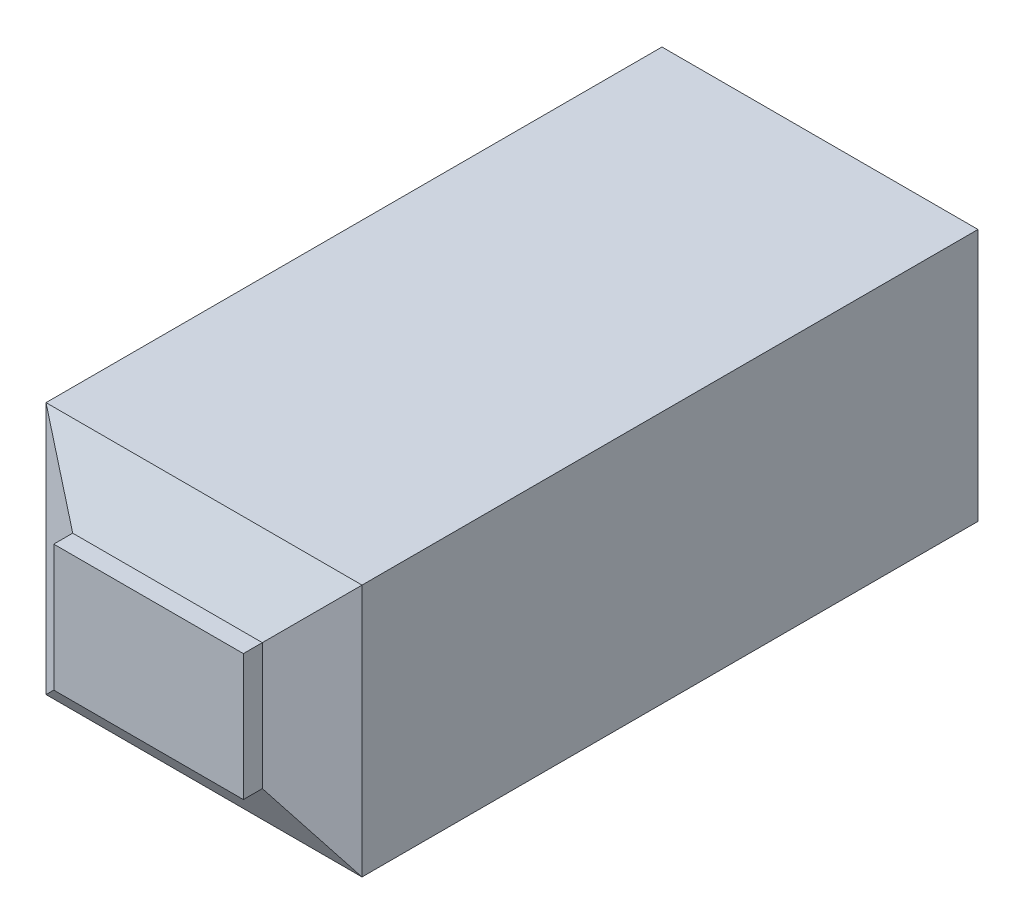
ISO-10303-21;
HEADER;
FILE_DESCRIPTION(('STEP AP214'),'2;1');
FILE_NAME('part.step','',(''),(''),'','','');
FILE_SCHEMA(('AUTOMOTIVE_DESIGN { 1 0 10303 214 1 1 1 1 }'));
ENDSEC;
DATA;
#1=APPLICATION_CONTEXT('core data for automotive mechanical design processes');
#2=APPLICATION_PROTOCOL_DEFINITION('international standard','automotive_design',2000,#1);
#3=PRODUCT_CONTEXT('',#1,'mechanical');
#4=PRODUCT('Part','Part','',(#3));
#5=PRODUCT_RELATED_PRODUCT_CATEGORY('part','',(#4));
#6=PRODUCT_DEFINITION_FORMATION('','',#4);
#7=PRODUCT_DEFINITION_CONTEXT('part definition',#1,'design');
#8=PRODUCT_DEFINITION('design','',#6,#7);
#9=PRODUCT_DEFINITION_SHAPE('','',#8);
#10=(LENGTH_UNIT() NAMED_UNIT(*) SI_UNIT(.MILLI.,.METRE.));
#11=(NAMED_UNIT(*) PLANE_ANGLE_UNIT() SI_UNIT($,.RADIAN.));
#12=(NAMED_UNIT(*) SI_UNIT($,.STERADIAN.) SOLID_ANGLE_UNIT());
#13=UNCERTAINTY_MEASURE_WITH_UNIT(LENGTH_MEASURE(1.E-05),#10,'distance_accuracy_value','');
#14=(GEOMETRIC_REPRESENTATION_CONTEXT(3) GLOBAL_UNCERTAINTY_ASSIGNED_CONTEXT((#13)) GLOBAL_UNIT_ASSIGNED_CONTEXT((#10,
#11,#12)) REPRESENTATION_CONTEXT('',''));
#15=CARTESIAN_POINT('',(0.,0.,0.));
#16=DIRECTION('',(0.,0.,1.));
#17=DIRECTION('',(1.,0.,0.));
#18=AXIS2_PLACEMENT_3D('',#15,#16,#17);
#19=CARTESIAN_POINT('',(25.,-20.,-115.));
#20=DIRECTION('',(1.,0.,0.));
#21=DIRECTION('',(0.,0.,-1.));
#22=AXIS2_PLACEMENT_3D('',#19,#20,#21);
#23=PLANE('',#22);
#24=DIRECTION('',(0.,0.,1.));
#25=VECTOR('',#24,1.);
#26=CARTESIAN_POINT('',(25.,-20.,-115.));
#27=LINE('',#26,#25);
#28=CARTESIAN_POINT('',(25.,-20.,-106.226497308104));
#29=VERTEX_POINT('',#28);
#30=CARTESIAN_POINT('',(25.,-20.,-8.77350269189622));
#31=VERTEX_POINT('',#30);
#32=EDGE_CURVE('E11',#29,#31,#27,.T.);
#33=ORIENTED_EDGE('',*,*,#32,.F.);
#34=DIRECTION('',(0.,1.,0.));
#35=VECTOR('',#34,1.);
#36=CARTESIAN_POINT('',(25.,-21.1,-106.226497308104));
#37=LINE('',#36,#35);
#38=CARTESIAN_POINT('',(25.,20.,-106.226497308104));
#39=VERTEX_POINT('',#38);
#40=EDGE_CURVE('E133',#29,#39,#37,.T.);
#41=ORIENTED_EDGE('',*,*,#40,.T.);
#42=DIRECTION('',(0.,0.,1.));
#43=VECTOR('',#42,1.);
#44=CARTESIAN_POINT('',(25.,20.,-115.));
#45=LINE('',#44,#43);
#46=CARTESIAN_POINT('',(25.,20.,-8.77350269189622));
#47=VERTEX_POINT('',#46);
#48=EDGE_CURVE('E40',#39,#47,#45,.T.);
#49=ORIENTED_EDGE('',*,*,#48,.T.);
#50=DIRECTION('',(0.,1.,0.));
#51=VECTOR('',#50,1.);
#52=CARTESIAN_POINT('',(25.,-21.1,-8.77350269189622));
#53=LINE('',#52,#51);
#54=EDGE_CURVE('E193',#31,#47,#53,.T.);
#55=ORIENTED_EDGE('',*,*,#54,.F.);
#56=EDGE_LOOP('',(#33,#41,#49,#55));
#57=FACE_BOUND('',#56,.T.);
#58=ADVANCED_FACE('F37',(#57),#23,.T.);
#59=CARTESIAN_POINT('',(-25.,-20.,-115.));
#60=DIRECTION('',(0.,-1.,0.));
#61=DIRECTION('',(0.,0.,-1.));
#62=AXIS2_PLACEMENT_3D('',#59,#60,#61);
#63=PLANE('',#62);
#64=DIRECTION('',(0.,0.,1.));
#65=VECTOR('',#64,1.);
#66=CARTESIAN_POINT('',(-25.,-20.,-115.));
#67=LINE('',#66,#65);
#68=CARTESIAN_POINT('',(-25.,-20.,-106.226497308104));
#69=VERTEX_POINT('',#68);
#70=CARTESIAN_POINT('',(-25.,-20.,-8.77350269189622));
#71=VERTEX_POINT('',#70);
#72=EDGE_CURVE('E45',#69,#71,#67,.T.);
#73=ORIENTED_EDGE('',*,*,#72,.F.);
#74=DIRECTION('',(1.,0.,0.));
#75=VECTOR('',#74,1.);
#76=CARTESIAN_POINT('',(-26.1,-20.,-106.226497308104));
#77=LINE('',#76,#75);
#78=EDGE_CURVE('E226',#69,#29,#77,.T.);
#79=ORIENTED_EDGE('',*,*,#78,.T.);
#80=ORIENTED_EDGE('',*,*,#32,.T.);
#81=DIRECTION('',(1.,0.,0.));
#82=VECTOR('',#81,1.);
#83=CARTESIAN_POINT('',(-26.1,-20.,-8.77350269189622));
#84=LINE('',#83,#82);
#85=EDGE_CURVE('E201',#71,#31,#84,.T.);
#86=ORIENTED_EDGE('',*,*,#85,.F.);
#87=EDGE_LOOP('',(#73,#79,#80,#86));
#88=FACE_BOUND('',#87,.T.);
#89=ADVANCED_FACE('F225',(#88),#63,.T.);
#90=CARTESIAN_POINT('',(-25.,-20.,-115.));
#91=DIRECTION('',(-1.,0.,0.));
#92=DIRECTION('',(0.,0.,1.));
#93=AXIS2_PLACEMENT_3D('',#90,#91,#92);
#94=PLANE('',#93);
#95=DIRECTION('',(0.,0.,1.));
#96=VECTOR('',#95,1.);
#97=CARTESIAN_POINT('',(-25.,20.,-115.));
#98=LINE('',#97,#96);
#99=CARTESIAN_POINT('',(-25.,20.,-106.226497308104));
#100=VERTEX_POINT('',#99);
#101=CARTESIAN_POINT('',(-25.,20.,-8.77350269189622));
#102=VERTEX_POINT('',#101);
#103=EDGE_CURVE('E157',#100,#102,#98,.T.);
#104=ORIENTED_EDGE('',*,*,#103,.F.);
#105=DIRECTION('',(0.,-1.,0.));
#106=VECTOR('',#105,1.);
#107=CARTESIAN_POINT('',(-25.,21.1,-106.226497308104));
#108=LINE('',#107,#106);
#109=EDGE_CURVE('E212',#100,#69,#108,.T.);
#110=ORIENTED_EDGE('',*,*,#109,.T.);
#111=ORIENTED_EDGE('',*,*,#72,.T.);
#112=DIRECTION('',(0.,-1.,0.));
#113=VECTOR('',#112,1.);
#114=CARTESIAN_POINT('',(-25.,21.1,-8.77350269189622));
#115=LINE('',#114,#113);
#116=EDGE_CURVE('E176',#102,#71,#115,.T.);
#117=ORIENTED_EDGE('',*,*,#116,.F.);
#118=EDGE_LOOP('',(#104,#110,#111,#117));
#119=FACE_BOUND('',#118,.T.);
#120=ADVANCED_FACE('F211',(#119),#94,.T.);
#121=CARTESIAN_POINT('',(-25.,20.,-115.));
#122=DIRECTION('',(0.,1.,0.));
#123=DIRECTION('',(0.,0.,1.));
#124=AXIS2_PLACEMENT_3D('',#121,#122,#123);
#125=PLANE('',#124);
#126=ORIENTED_EDGE('',*,*,#48,.F.);
#127=DIRECTION('',(-1.,0.,0.));
#128=VECTOR('',#127,1.);
#129=CARTESIAN_POINT('',(26.1,20.,-106.226497308104));
#130=LINE('',#129,#128);
#131=EDGE_CURVE('E139',#39,#100,#130,.T.);
#132=ORIENTED_EDGE('',*,*,#131,.T.);
#133=ORIENTED_EDGE('',*,*,#103,.T.);
#134=DIRECTION('',(-1.,0.,0.));
#135=VECTOR('',#134,1.);
#136=CARTESIAN_POINT('',(26.1,20.,-8.77350269189622));
#137=LINE('',#136,#135);
#138=EDGE_CURVE('E156',#47,#102,#137,.T.);
#139=ORIENTED_EDGE('',*,*,#138,.F.);
#140=EDGE_LOOP('',(#126,#132,#133,#139));
#141=FACE_BOUND('',#140,.T.);
#142=ADVANCED_FACE('F154',(#141),#125,.T.);
#143=CARTESIAN_POINT('',(-26.1,-9.99999999999998,0.));
#144=DIRECTION('',(0.,-1.,0.));
#145=DIRECTION('',(0.,0.,-1.));
#146=AXIS2_PLACEMENT_3D('',#143,#144,#145);
#147=PLANE('',#146);
#148=DIRECTION('',(1.,0.,0.));
#149=VECTOR('',#148,1.);
#150=CARTESIAN_POINT('',(-26.1,-9.99999999999998,-3.));
#151=LINE('',#150,#149);
#152=CARTESIAN_POINT('',(-15.,-9.99999999999998,-3.));
#153=VERTEX_POINT('',#152);
#154=CARTESIAN_POINT('',(15.,-9.99999999999998,-3.));
#155=VERTEX_POINT('',#154);
#156=EDGE_CURVE('E190',#153,#155,#151,.T.);
#157=ORIENTED_EDGE('',*,*,#156,.T.);
#158=DIRECTION('',(0.,0.,1.));
#159=VECTOR('',#158,1.);
#160=CARTESIAN_POINT('',(15.,-9.99999999999998,0.));
#161=LINE('',#160,#159);
#162=CARTESIAN_POINT('',(15.,-9.99999999999998,0.));
#163=VERTEX_POINT('',#162);
#164=EDGE_CURVE('E185',#155,#163,#161,.T.);
#165=ORIENTED_EDGE('',*,*,#164,.T.);
#166=DIRECTION('',(1.,0.,0.));
#167=VECTOR('',#166,1.);
#168=CARTESIAN_POINT('',(-26.1,-9.99999999999998,0.));
#169=LINE('',#168,#167);
#170=CARTESIAN_POINT('',(-15.,-9.99999999999998,0.));
#171=VERTEX_POINT('',#170);
#172=EDGE_CURVE('E198',#171,#163,#169,.T.);
#173=ORIENTED_EDGE('',*,*,#172,.F.);
#174=DIRECTION('',(0.,0.,1.));
#175=VECTOR('',#174,1.);
#176=CARTESIAN_POINT('',(-15.,-9.99999999999998,0.));
#177=LINE('',#176,#175);
#178=EDGE_CURVE('E168',#153,#171,#177,.T.);
#179=ORIENTED_EDGE('',*,*,#178,.F.);
#180=EDGE_LOOP('',(#157,#165,#173,#179));
#181=FACE_BOUND('',#180,.T.);
#182=ADVANCED_FACE('F253',(#181),#147,.T.);
#183=CARTESIAN_POINT('',(-26.1,-9.99999999999998,-3.));
#184=DIRECTION('',(0.,-0.499999999999998,0.86602540378444));
#185=DIRECTION('',(0.,-0.86602540378444,-0.499999999999998));
#186=AXIS2_PLACEMENT_3D('',#183,#184,#185);
#187=PLANE('',#186);
#188=ORIENTED_EDGE('',*,*,#85,.T.);
#189=DIRECTION('',(-0.654653670707978,0.654653670707978,0.377964473009225));
#190=VECTOR('',#189,1.);
#191=CARTESIAN_POINT('',(19.7571428571428,-14.7571428571429,-5.74653770914492));
#192=LINE('',#191,#190);
#193=EDGE_CURVE('E188',#31,#155,#192,.T.);
#194=ORIENTED_EDGE('',*,*,#193,.T.);
#195=ORIENTED_EDGE('',*,*,#156,.F.);
#196=DIRECTION('',(0.654653670707978,0.654653670707978,0.377964473009225));
#197=VECTOR('',#196,1.);
#198=CARTESIAN_POINT('',(-1.67142857142853,3.32857142857146,4.69525430219883));
#199=LINE('',#198,#197);
#200=EDGE_CURVE('E172',#71,#153,#199,.T.);
#201=ORIENTED_EDGE('',*,*,#200,.F.);
#202=EDGE_LOOP('',(#188,#194,#195,#201));
#203=FACE_BOUND('',#202,.T.);
#204=ADVANCED_FACE('F217',(#203),#187,.T.);
#205=CARTESIAN_POINT('',(15.,-21.1,0.));
#206=DIRECTION('',(1.,0.,0.));
#207=DIRECTION('',(0.,0.,-1.));
#208=AXIS2_PLACEMENT_3D('',#205,#206,#207);
#209=PLANE('',#208);
#210=DIRECTION('',(0.,1.,0.));
#211=VECTOR('',#210,1.);
#212=CARTESIAN_POINT('',(15.,-21.1,-3.));
#213=LINE('',#212,#211);
#214=CARTESIAN_POINT('',(15.,9.99999999999998,-3.));
#215=VERTEX_POINT('',#214);
#216=EDGE_CURVE('E177',#155,#215,#213,.T.);
#217=ORIENTED_EDGE('',*,*,#216,.T.);
#218=DIRECTION('',(0.,0.,1.));
#219=VECTOR('',#218,1.);
#220=CARTESIAN_POINT('',(15.,9.99999999999998,0.));
#221=LINE('',#220,#219);
#222=CARTESIAN_POINT('',(15.,9.99999999999998,0.));
#223=VERTEX_POINT('',#222);
#224=EDGE_CURVE('E171',#215,#223,#221,.T.);
#225=ORIENTED_EDGE('',*,*,#224,.T.);
#226=DIRECTION('',(0.,1.,0.));
#227=VECTOR('',#226,1.);
#228=CARTESIAN_POINT('',(15.,-21.1,0.));
#229=LINE('',#228,#227);
#230=EDGE_CURVE('E187',#163,#223,#229,.T.);
#231=ORIENTED_EDGE('',*,*,#230,.F.);
#232=ORIENTED_EDGE('',*,*,#164,.F.);
#233=EDGE_LOOP('',(#217,#225,#231,#232));
#234=FACE_BOUND('',#233,.T.);
#235=ADVANCED_FACE('F257',(#234),#209,.T.);
#236=CARTESIAN_POINT('',(15.,-21.1,-3.));
#237=DIRECTION('',(0.499999999999998,0.,0.86602540378444));
#238=DIRECTION('',(0.86602540378444,0.,-0.499999999999998));
#239=AXIS2_PLACEMENT_3D('',#236,#237,#238);
#240=PLANE('',#239);
#241=ORIENTED_EDGE('',*,*,#54,.T.);
#242=DIRECTION('',(-0.654653670707978,-0.654653670707978,0.377964473009225));
#243=VECTOR('',#242,1.);
#244=CARTESIAN_POINT('',(19.7571428571429,14.7571428571429,-5.74653770914493));
#245=LINE('',#244,#243);
#246=EDGE_CURVE('E241',#47,#215,#245,.T.);
#247=ORIENTED_EDGE('',*,*,#246,.T.);
#248=ORIENTED_EDGE('',*,*,#216,.F.);
#249=ORIENTED_EDGE('',*,*,#193,.F.);
#250=EDGE_LOOP('',(#241,#247,#248,#249));
#251=FACE_BOUND('',#250,.T.);
#252=ADVANCED_FACE('F259',(#251),#240,.T.);
#253=CARTESIAN_POINT('',(-15.,21.1,0.));
#254=DIRECTION('',(-1.,0.,0.));
#255=DIRECTION('',(0.,0.,1.));
#256=AXIS2_PLACEMENT_3D('',#253,#254,#255);
#257=PLANE('',#256);
#258=DIRECTION('',(0.,-1.,0.));
#259=VECTOR('',#258,1.);
#260=CARTESIAN_POINT('',(-15.,21.1,-3.));
#261=LINE('',#260,#259);
#262=CARTESIAN_POINT('',(-15.,9.99999999999998,-3.));
#263=VERTEX_POINT('',#262);
#264=EDGE_CURVE('E180',#263,#153,#261,.T.);
#265=ORIENTED_EDGE('',*,*,#264,.T.);
#266=ORIENTED_EDGE('',*,*,#178,.T.);
#267=DIRECTION('',(0.,-1.,0.));
#268=VECTOR('',#267,1.);
#269=CARTESIAN_POINT('',(-15.,21.1,0.));
#270=LINE('',#269,#268);
#271=CARTESIAN_POINT('',(-15.,9.99999999999998,0.));
#272=VERTEX_POINT('',#271);
#273=EDGE_CURVE('E173',#272,#171,#270,.T.);
#274=ORIENTED_EDGE('',*,*,#273,.F.);
#275=DIRECTION('',(0.,0.,1.));
#276=VECTOR('',#275,1.);
#277=CARTESIAN_POINT('',(-15.,9.99999999999998,0.));
#278=LINE('',#277,#276);
#279=EDGE_CURVE('E239',#263,#272,#278,.T.);
#280=ORIENTED_EDGE('',*,*,#279,.F.);
#281=EDGE_LOOP('',(#265,#266,#274,#280));
#282=FACE_BOUND('',#281,.T.);
#283=ADVANCED_FACE('F251',(#282),#257,.T.);
#284=CARTESIAN_POINT('',(-15.,21.1,-3.));
#285=DIRECTION('',(-0.499999999999998,0.,0.86602540378444));
#286=DIRECTION('',(0.86602540378444,0.,0.499999999999998));
#287=AXIS2_PLACEMENT_3D('',#284,#285,#286);
#288=PLANE('',#287);
#289=ORIENTED_EDGE('',*,*,#116,.T.);
#290=ORIENTED_EDGE('',*,*,#200,.T.);
#291=ORIENTED_EDGE('',*,*,#264,.F.);
#292=DIRECTION('',(0.654653670707978,-0.654653670707978,0.377964473009225));
#293=VECTOR('',#292,1.);
#294=CARTESIAN_POINT('',(2.61428571428576,-7.61428571428576,7.16961259872578));
#295=LINE('',#294,#293);
#296=EDGE_CURVE('E224',#102,#263,#295,.T.);
#297=ORIENTED_EDGE('',*,*,#296,.F.);
#298=EDGE_LOOP('',(#289,#290,#291,#297));
#299=FACE_BOUND('',#298,.T.);
#300=ADVANCED_FACE('F222',(#299),#288,.T.);
#301=CARTESIAN_POINT('',(26.1,9.99999999999998,0.));
#302=DIRECTION('',(0.,1.,0.));
#303=DIRECTION('',(0.,0.,1.));
#304=AXIS2_PLACEMENT_3D('',#301,#302,#303);
#305=PLANE('',#304);
#306=ORIENTED_EDGE('',*,*,#224,.F.);
#307=DIRECTION('',(-1.,0.,0.));
#308=VECTOR('',#307,1.);
#309=CARTESIAN_POINT('',(26.1,9.99999999999998,-3.));
#310=LINE('',#309,#308);
#311=EDGE_CURVE('E158',#215,#263,#310,.T.);
#312=ORIENTED_EDGE('',*,*,#311,.T.);
#313=ORIENTED_EDGE('',*,*,#279,.T.);
#314=DIRECTION('',(-1.,0.,0.));
#315=VECTOR('',#314,1.);
#316=CARTESIAN_POINT('',(26.1,9.99999999999998,0.));
#317=LINE('',#316,#315);
#318=EDGE_CURVE('E164',#223,#272,#317,.T.);
#319=ORIENTED_EDGE('',*,*,#318,.F.);
#320=EDGE_LOOP('',(#306,#312,#313,#319));
#321=FACE_BOUND('',#320,.T.);
#322=ADVANCED_FACE('F249',(#321),#305,.T.);
#323=CARTESIAN_POINT('',(26.1,9.99999999999998,-3.));
#324=DIRECTION('',(0.,0.499999999999998,0.86602540378444));
#325=DIRECTION('',(0.,-0.86602540378444,0.499999999999998));
#326=AXIS2_PLACEMENT_3D('',#323,#324,#325);
#327=PLANE('',#326);
#328=ORIENTED_EDGE('',*,*,#246,.F.);
#329=ORIENTED_EDGE('',*,*,#138,.T.);
#330=ORIENTED_EDGE('',*,*,#296,.T.);
#331=ORIENTED_EDGE('',*,*,#311,.F.);
#332=EDGE_LOOP('',(#328,#329,#330,#331));
#333=FACE_BOUND('',#332,.T.);
#334=ADVANCED_FACE('F261',(#333),#327,.T.);
#335=CARTESIAN_POINT('',(0.,0.,0.));
#336=DIRECTION('',(0.,0.,-1.));
#337=DIRECTION('',(-1.,0.,0.));
#338=AXIS2_PLACEMENT_3D('',#335,#336,#337);
#339=PLANE('',#338);
#340=ORIENTED_EDGE('',*,*,#172,.T.);
#341=ORIENTED_EDGE('',*,*,#230,.T.);
#342=ORIENTED_EDGE('',*,*,#318,.T.);
#343=ORIENTED_EDGE('',*,*,#273,.T.);
#344=EDGE_LOOP('',(#340,#341,#342,#343));
#345=FACE_BOUND('',#344,.T.);
#346=ADVANCED_FACE('F246',(#345),#339,.F.);
#347=CARTESIAN_POINT('',(-26.1,-9.99999999999998,-115.));
#348=DIRECTION('',(0.,-1.,0.));
#349=DIRECTION('',(0.,0.,-1.));
#350=AXIS2_PLACEMENT_3D('',#347,#348,#349);
#351=PLANE('',#350);
#352=DIRECTION('',(1.,0.,0.));
#353=VECTOR('',#352,1.);
#354=CARTESIAN_POINT('',(-26.1,-9.99999999999998,-115.));
#355=LINE('',#354,#353);
#356=CARTESIAN_POINT('',(-15.,-9.99999999999998,-115.));
#357=VERTEX_POINT('',#356);
#358=CARTESIAN_POINT('',(15.,-9.99999999999998,-115.));
#359=VERTEX_POINT('',#358);
#360=EDGE_CURVE('E229',#357,#359,#355,.T.);
#361=ORIENTED_EDGE('',*,*,#360,.T.);
#362=DIRECTION('',(0.,0.,1.));
#363=VECTOR('',#362,1.);
#364=CARTESIAN_POINT('',(15.,-9.99999999999998,-115.));
#365=LINE('',#364,#363);
#366=CARTESIAN_POINT('',(15.,-9.99999999999998,-112.));
#367=VERTEX_POINT('',#366);
#368=EDGE_CURVE('E232',#359,#367,#365,.T.);
#369=ORIENTED_EDGE('',*,*,#368,.T.);
#370=DIRECTION('',(1.,0.,0.));
#371=VECTOR('',#370,1.);
#372=CARTESIAN_POINT('',(-26.1,-9.99999999999998,-112.));
#373=LINE('',#372,#371);
#374=CARTESIAN_POINT('',(-15.,-9.99999999999998,-112.));
#375=VERTEX_POINT('',#374);
#376=EDGE_CURVE('E230',#375,#367,#373,.T.);
#377=ORIENTED_EDGE('',*,*,#376,.F.);
#378=DIRECTION('',(0.,0.,1.));
#379=VECTOR('',#378,1.);
#380=CARTESIAN_POINT('',(-15.,-9.99999999999998,-115.));
#381=LINE('',#380,#379);
#382=EDGE_CURVE('E502',#357,#375,#381,.T.);
#383=ORIENTED_EDGE('',*,*,#382,.F.);
#384=EDGE_LOOP('',(#361,#369,#377,#383));
#385=FACE_BOUND('',#384,.T.);
#386=ADVANCED_FACE('F268',(#385),#351,.T.);
#387=CARTESIAN_POINT('',(-26.1,-9.99999999999998,-112.));
#388=DIRECTION('',(0.,-0.499999999999998,-0.86602540378444));
#389=DIRECTION('',(0.,0.86602540378444,-0.499999999999998));
#390=AXIS2_PLACEMENT_3D('',#387,#388,#389);
#391=PLANE('',#390);
#392=ORIENTED_EDGE('',*,*,#376,.T.);
#393=DIRECTION('',(0.654653670707978,-0.654653670707978,0.377964473009225));
#394=VECTOR('',#393,1.);
#395=CARTESIAN_POINT('',(19.7571428571428,-14.7571428571429,-109.253462290855));
#396=LINE('',#395,#394);
#397=EDGE_CURVE('E507',#367,#29,#396,.T.);
#398=ORIENTED_EDGE('',*,*,#397,.T.);
#399=ORIENTED_EDGE('',*,*,#78,.F.);
#400=DIRECTION('',(-0.654653670707978,-0.654653670707978,0.377964473009225));
#401=VECTOR('',#400,1.);
#402=CARTESIAN_POINT('',(-1.67142857142853,3.32857142857146,-119.695254302199));
#403=LINE('',#402,#401);
#404=EDGE_CURVE('E495',#375,#69,#403,.T.);
#405=ORIENTED_EDGE('',*,*,#404,.F.);
#406=EDGE_LOOP('',(#392,#398,#399,#405));
#407=FACE_BOUND('',#406,.T.);
#408=ADVANCED_FACE('F325',(#407),#391,.T.);
#409=CARTESIAN_POINT('',(15.,-21.1,-115.));
#410=DIRECTION('',(1.,0.,0.));
#411=DIRECTION('',(0.,0.,-1.));
#412=AXIS2_PLACEMENT_3D('',#409,#410,#411);
#413=PLANE('',#412);
#414=DIRECTION('',(0.,1.,0.));
#415=VECTOR('',#414,1.);
#416=CARTESIAN_POINT('',(15.,-21.1,-115.));
#417=LINE('',#416,#415);
#418=CARTESIAN_POINT('',(15.,9.99999999999998,-115.));
#419=VERTEX_POINT('',#418);
#420=EDGE_CURVE('E151',#359,#419,#417,.T.);
#421=ORIENTED_EDGE('',*,*,#420,.T.);
#422=DIRECTION('',(0.,0.,1.));
#423=VECTOR('',#422,1.);
#424=CARTESIAN_POINT('',(15.,9.99999999999998,-115.));
#425=LINE('',#424,#423);
#426=CARTESIAN_POINT('',(15.,9.99999999999998,-112.));
#427=VERTEX_POINT('',#426);
#428=EDGE_CURVE('E61',#419,#427,#425,.T.);
#429=ORIENTED_EDGE('',*,*,#428,.T.);
#430=DIRECTION('',(0.,1.,0.));
#431=VECTOR('',#430,1.);
#432=CARTESIAN_POINT('',(15.,-21.1,-112.));
#433=LINE('',#432,#431);
#434=EDGE_CURVE('E136',#367,#427,#433,.T.);
#435=ORIENTED_EDGE('',*,*,#434,.F.);
#436=ORIENTED_EDGE('',*,*,#368,.F.);
#437=EDGE_LOOP('',(#421,#429,#435,#436));
#438=FACE_BOUND('',#437,.T.);
#439=ADVANCED_FACE('F336',(#438),#413,.T.);
#440=CARTESIAN_POINT('',(15.,-21.1,-112.));
#441=DIRECTION('',(0.499999999999998,0.,-0.86602540378444));
#442=DIRECTION('',(-0.86602540378444,0.,-0.499999999999998));
#443=AXIS2_PLACEMENT_3D('',#440,#441,#442);
#444=PLANE('',#443);
#445=ORIENTED_EDGE('',*,*,#434,.T.);
#446=DIRECTION('',(0.654653670707978,0.654653670707978,0.377964473009225));
#447=VECTOR('',#446,1.);
#448=CARTESIAN_POINT('',(19.7571428571429,14.7571428571429,-109.253462290855));
#449=LINE('',#448,#447);
#450=EDGE_CURVE('E129',#427,#39,#449,.T.);
#451=ORIENTED_EDGE('',*,*,#450,.T.);
#452=ORIENTED_EDGE('',*,*,#40,.F.);
#453=ORIENTED_EDGE('',*,*,#397,.F.);
#454=EDGE_LOOP('',(#445,#451,#452,#453));
#455=FACE_BOUND('',#454,.T.);
#456=ADVANCED_FACE('F130',(#455),#444,.T.);
#457=CARTESIAN_POINT('',(-15.,21.1,-115.));
#458=DIRECTION('',(-1.,0.,0.));
#459=DIRECTION('',(0.,0.,1.));
#460=AXIS2_PLACEMENT_3D('',#457,#458,#459);
#461=PLANE('',#460);
#462=DIRECTION('',(0.,-1.,0.));
#463=VECTOR('',#462,1.);
#464=CARTESIAN_POINT('',(-15.,21.1,-115.));
#465=LINE('',#464,#463);
#466=CARTESIAN_POINT('',(-15.,9.99999999999998,-115.));
#467=VERTEX_POINT('',#466);
#468=EDGE_CURVE('E499',#467,#357,#465,.T.);
#469=ORIENTED_EDGE('',*,*,#468,.T.);
#470=ORIENTED_EDGE('',*,*,#382,.T.);
#471=DIRECTION('',(0.,-1.,0.));
#472=VECTOR('',#471,1.);
#473=CARTESIAN_POINT('',(-15.,21.1,-112.));
#474=LINE('',#473,#472);
#475=CARTESIAN_POINT('',(-15.,9.99999999999998,-112.));
#476=VERTEX_POINT('',#475);
#477=EDGE_CURVE('E494',#476,#375,#474,.T.);
#478=ORIENTED_EDGE('',*,*,#477,.F.);
#479=DIRECTION('',(0.,0.,1.));
#480=VECTOR('',#479,1.);
#481=CARTESIAN_POINT('',(-15.,9.99999999999998,-115.));
#482=LINE('',#481,#480);
#483=EDGE_CURVE('E518',#467,#476,#482,.T.);
#484=ORIENTED_EDGE('',*,*,#483,.F.);
#485=EDGE_LOOP('',(#469,#470,#478,#484));
#486=FACE_BOUND('',#485,.T.);
#487=ADVANCED_FACE('F354',(#486),#461,.T.);
#488=CARTESIAN_POINT('',(-15.,21.1,-112.));
#489=DIRECTION('',(-0.499999999999998,0.,-0.86602540378444));
#490=DIRECTION('',(-0.86602540378444,0.,0.499999999999998));
#491=AXIS2_PLACEMENT_3D('',#488,#489,#490);
#492=PLANE('',#491);
#493=ORIENTED_EDGE('',*,*,#477,.T.);
#494=ORIENTED_EDGE('',*,*,#404,.T.);
#495=ORIENTED_EDGE('',*,*,#109,.F.);
#496=DIRECTION('',(-0.654653670707978,0.654653670707978,0.377964473009225));
#497=VECTOR('',#496,1.);
#498=CARTESIAN_POINT('',(2.61428571428576,-7.61428571428576,-122.169612598726));
#499=LINE('',#498,#497);
#500=EDGE_CURVE('E53',#476,#100,#499,.T.);
#501=ORIENTED_EDGE('',*,*,#500,.F.);
#502=EDGE_LOOP('',(#493,#494,#495,#501));
#503=FACE_BOUND('',#502,.T.);
#504=ADVANCED_FACE('F363',(#503),#492,.T.);
#505=CARTESIAN_POINT('',(26.1,9.99999999999998,-115.));
#506=DIRECTION('',(0.,1.,0.));
#507=DIRECTION('',(0.,0.,1.));
#508=AXIS2_PLACEMENT_3D('',#505,#506,#507);
#509=PLANE('',#508);
#510=ORIENTED_EDGE('',*,*,#428,.F.);
#511=DIRECTION('',(-1.,0.,0.));
#512=VECTOR('',#511,1.);
#513=CARTESIAN_POINT('',(26.1,9.99999999999998,-115.));
#514=LINE('',#513,#512);
#515=EDGE_CURVE('E144',#419,#467,#514,.T.);
#516=ORIENTED_EDGE('',*,*,#515,.T.);
#517=ORIENTED_EDGE('',*,*,#483,.T.);
#518=DIRECTION('',(-1.,0.,0.));
#519=VECTOR('',#518,1.);
#520=CARTESIAN_POINT('',(26.1,9.99999999999998,-112.));
#521=LINE('',#520,#519);
#522=EDGE_CURVE('E145',#427,#476,#521,.T.);
#523=ORIENTED_EDGE('',*,*,#522,.F.);
#524=EDGE_LOOP('',(#510,#516,#517,#523));
#525=FACE_BOUND('',#524,.T.);
#526=ADVANCED_FACE('F373',(#525),#509,.T.);
#527=CARTESIAN_POINT('',(26.1,9.99999999999998,-112.));
#528=DIRECTION('',(0.,0.499999999999998,-0.86602540378444));
#529=DIRECTION('',(0.,0.86602540378444,0.499999999999998));
#530=AXIS2_PLACEMENT_3D('',#527,#528,#529);
#531=PLANE('',#530);
#532=ORIENTED_EDGE('',*,*,#450,.F.);
#533=ORIENTED_EDGE('',*,*,#522,.T.);
#534=ORIENTED_EDGE('',*,*,#500,.T.);
#535=ORIENTED_EDGE('',*,*,#131,.F.);
#536=EDGE_LOOP('',(#532,#533,#534,#535));
#537=FACE_BOUND('',#536,.T.);
#538=ADVANCED_FACE('F140',(#537),#531,.T.);
#539=CARTESIAN_POINT('',(0.,0.,-115.));
#540=DIRECTION('',(0.,0.,-1.));
#541=DIRECTION('',(-1.,0.,0.));
#542=AXIS2_PLACEMENT_3D('',#539,#540,#541);
#543=PLANE('',#542);
#544=ORIENTED_EDGE('',*,*,#420,.F.);
#545=ORIENTED_EDGE('',*,*,#360,.F.);
#546=ORIENTED_EDGE('',*,*,#468,.F.);
#547=ORIENTED_EDGE('',*,*,#515,.F.);
#548=EDGE_LOOP('',(#544,#545,#546,#547));
#549=FACE_BOUND('',#548,.T.);
#550=ADVANCED_FACE('F283',(#549),#543,.T.);
#551=CLOSED_SHELL('',(#58,#89,#120,#142,#182,#204,#235,#252,#283,#300,#322,#334,#346,#386,#408,
#439,#456,#487,#504,#526,#538,#550));
#552=MANIFOLD_SOLID_BREP('B2',#551);
#553=ADVANCED_BREP_SHAPE_REPRESENTATION('',(#18,#552),#14);
#554=SHAPE_DEFINITION_REPRESENTATION(#9,#553);
ENDSEC;
END-ISO-10303-21;
